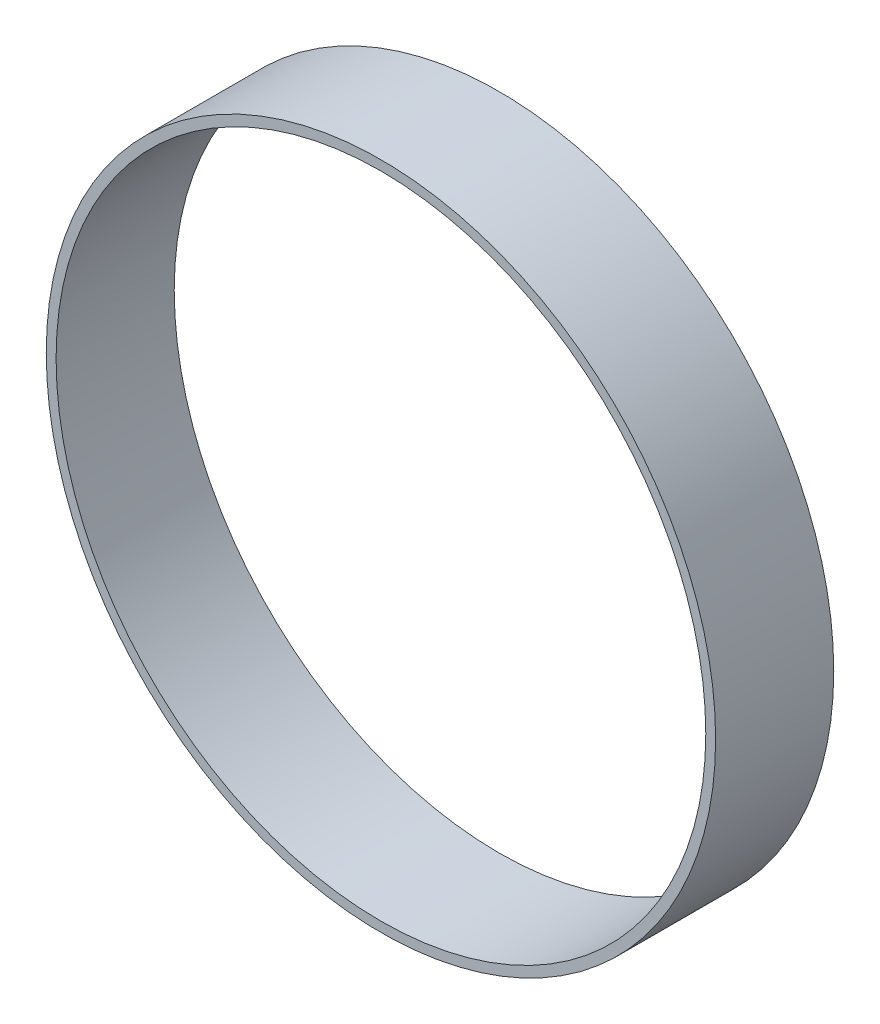
ISO-10303-21;
HEADER;
FILE_DESCRIPTION(('STEP AP214'),'2;1');
FILE_NAME('part.step','',(''),(''),'','','');
FILE_SCHEMA(('AUTOMOTIVE_DESIGN { 1 0 10303 214 1 1 1 1 }'));
ENDSEC;
DATA;
#1=APPLICATION_CONTEXT('core data for automotive mechanical design processes');
#2=APPLICATION_PROTOCOL_DEFINITION('international standard','automotive_design',2000,#1);
#3=PRODUCT_CONTEXT('',#1,'mechanical');
#4=PRODUCT('Part','Part','',(#3));
#5=PRODUCT_RELATED_PRODUCT_CATEGORY('part','',(#4));
#6=PRODUCT_DEFINITION_FORMATION('','',#4);
#7=PRODUCT_DEFINITION_CONTEXT('part definition',#1,'design');
#8=PRODUCT_DEFINITION('design','',#6,#7);
#9=PRODUCT_DEFINITION_SHAPE('','',#8);
#10=(LENGTH_UNIT() NAMED_UNIT(*) SI_UNIT(.MILLI.,.METRE.));
#11=(NAMED_UNIT(*) PLANE_ANGLE_UNIT() SI_UNIT($,.RADIAN.));
#12=(NAMED_UNIT(*) SI_UNIT($,.STERADIAN.) SOLID_ANGLE_UNIT());
#13=UNCERTAINTY_MEASURE_WITH_UNIT(LENGTH_MEASURE(1.E-05),#10,'distance_accuracy_value','');
#14=(GEOMETRIC_REPRESENTATION_CONTEXT(3) GLOBAL_UNCERTAINTY_ASSIGNED_CONTEXT((#13)) GLOBAL_UNIT_ASSIGNED_CONTEXT((#10,
#11,#12)) REPRESENTATION_CONTEXT('',''));
#15=CARTESIAN_POINT('',(0.,0.,0.));
#16=DIRECTION('',(0.,0.,1.));
#17=DIRECTION('',(1.,0.,0.));
#18=AXIS2_PLACEMENT_3D('',#15,#16,#17);
#19=CARTESIAN_POINT('',(0.,0.,38.1));
#20=DIRECTION('',(0.,0.,1.));
#21=DIRECTION('',(1.,0.,0.));
#22=AXIS2_PLACEMENT_3D('',#19,#20,#21);
#23=PLANE('',#22);
#24=CARTESIAN_POINT('',(0.,0.,38.1));
#25=DIRECTION('',(0.,0.,1.));
#26=DIRECTION('',(1.,0.,0.));
#27=AXIS2_PLACEMENT_3D('',#24,#25,#26);
#28=CIRCLE('',#27,107.95);
#29=CARTESIAN_POINT('',(-107.95,0.,38.1));
#30=VERTEX_POINT('',#29);
#31=EDGE_CURVE('E10',#30,#30,#28,.T.);
#32=ORIENTED_EDGE('',*,*,#31,.T.);
#33=EDGE_LOOP('',(#32));
#34=FACE_BOUND('',#33,.T.);
#35=CARTESIAN_POINT('',(0.,0.,38.1));
#36=DIRECTION('',(0.,0.,1.));
#37=DIRECTION('',(1.,0.,0.));
#38=AXIS2_PLACEMENT_3D('',#35,#36,#37);
#39=CIRCLE('',#38,104.775);
#40=CARTESIAN_POINT('',(-104.775,0.,38.1));
#41=VERTEX_POINT('',#40);
#42=EDGE_CURVE('E56',#41,#41,#39,.T.);
#43=ORIENTED_EDGE('',*,*,#42,.F.);
#44=EDGE_LOOP('',(#43));
#45=FACE_BOUND('',#44,.T.);
#46=ADVANCED_FACE('F43',(#34,#45),#23,.T.);
#47=CARTESIAN_POINT('',(0.,0.,0.));
#48=DIRECTION('',(0.,0.,1.));
#49=DIRECTION('',(1.,0.,0.));
#50=AXIS2_PLACEMENT_3D('',#47,#48,#49);
#51=PLANE('',#50);
#52=CARTESIAN_POINT('',(0.,0.,0.));
#53=DIRECTION('',(0.,0.,1.));
#54=DIRECTION('',(1.,0.,0.));
#55=AXIS2_PLACEMENT_3D('',#52,#53,#54);
#56=CIRCLE('',#55,107.95);
#57=CARTESIAN_POINT('',(-107.95,0.,0.));
#58=VERTEX_POINT('',#57);
#59=EDGE_CURVE('E47',#58,#58,#56,.T.);
#60=ORIENTED_EDGE('',*,*,#59,.F.);
#61=EDGE_LOOP('',(#60));
#62=FACE_BOUND('',#61,.T.);
#63=CARTESIAN_POINT('',(0.,0.,0.));
#64=DIRECTION('',(0.,0.,1.));
#65=DIRECTION('',(1.,0.,0.));
#66=AXIS2_PLACEMENT_3D('',#63,#64,#65);
#67=CIRCLE('',#66,104.775);
#68=CARTESIAN_POINT('',(-104.775,0.,0.));
#69=VERTEX_POINT('',#68);
#70=EDGE_CURVE('E58',#69,#69,#67,.T.);
#71=ORIENTED_EDGE('',*,*,#70,.T.);
#72=EDGE_LOOP('',(#71));
#73=FACE_BOUND('',#72,.T.);
#74=ADVANCED_FACE('F70',(#62,#73),#51,.F.);
#75=CARTESIAN_POINT('',(0.,0.,38.1));
#76=DIRECTION('',(0.,0.,-1.));
#77=DIRECTION('',(-1.,0.,0.));
#78=AXIS2_PLACEMENT_3D('',#75,#76,#77);
#79=CYLINDRICAL_SURFACE('',#78,107.95);
#80=CARTESIAN_POINT('',(-107.95,0.,38.1));
#81=CARTESIAN_POINT('',(-107.95,0.,37.703125));
#82=CARTESIAN_POINT('',(-107.95,0.,37.30625));
#83=CARTESIAN_POINT('',(-107.95,0.,36.5125));
#84=CARTESIAN_POINT('',(-107.95,0.,36.115625));
#85=CARTESIAN_POINT('',(-107.95,0.,35.321875));
#86=CARTESIAN_POINT('',(-107.95,0.,34.925));
#87=CARTESIAN_POINT('',(-107.95,0.,34.13125));
#88=CARTESIAN_POINT('',(-107.95,0.,33.734375));
#89=CARTESIAN_POINT('',(-107.95,0.,32.940625));
#90=CARTESIAN_POINT('',(-107.95,0.,32.54375));
#91=CARTESIAN_POINT('',(-107.95,0.,31.75));
#92=CARTESIAN_POINT('',(-107.95,0.,31.353125));
#93=CARTESIAN_POINT('',(-107.95,0.,30.559375));
#94=CARTESIAN_POINT('',(-107.95,0.,30.1625));
#95=CARTESIAN_POINT('',(-107.95,0.,29.36875));
#96=CARTESIAN_POINT('',(-107.95,0.,28.971875));
#97=CARTESIAN_POINT('',(-107.95,0.,28.178125));
#98=CARTESIAN_POINT('',(-107.95,0.,27.78125));
#99=CARTESIAN_POINT('',(-107.95,0.,26.9875));
#100=CARTESIAN_POINT('',(-107.95,0.,26.590625));
#101=CARTESIAN_POINT('',(-107.95,0.,25.796875));
#102=CARTESIAN_POINT('',(-107.95,0.,25.4));
#103=CARTESIAN_POINT('',(-107.95,0.,24.60625));
#104=CARTESIAN_POINT('',(-107.95,0.,24.209375));
#105=CARTESIAN_POINT('',(-107.95,0.,23.415625));
#106=CARTESIAN_POINT('',(-107.95,0.,23.01875));
#107=CARTESIAN_POINT('',(-107.95,0.,22.225));
#108=CARTESIAN_POINT('',(-107.95,0.,21.828125));
#109=CARTESIAN_POINT('',(-107.95,0.,21.034375));
#110=CARTESIAN_POINT('',(-107.95,0.,20.6375));
#111=CARTESIAN_POINT('',(-107.95,0.,19.84375));
#112=CARTESIAN_POINT('',(-107.95,0.,19.446875));
#113=CARTESIAN_POINT('',(-107.95,0.,18.653125));
#114=CARTESIAN_POINT('',(-107.95,0.,18.25625));
#115=CARTESIAN_POINT('',(-107.95,0.,17.4625));
#116=CARTESIAN_POINT('',(-107.95,0.,17.065625));
#117=CARTESIAN_POINT('',(-107.95,0.,16.271875));
#118=CARTESIAN_POINT('',(-107.95,0.,15.875));
#119=CARTESIAN_POINT('',(-107.95,0.,15.08125));
#120=CARTESIAN_POINT('',(-107.95,0.,14.684375));
#121=CARTESIAN_POINT('',(-107.95,0.,13.890625));
#122=CARTESIAN_POINT('',(-107.95,0.,13.49375));
#123=CARTESIAN_POINT('',(-107.95,0.,12.7));
#124=CARTESIAN_POINT('',(-107.95,0.,12.303125));
#125=CARTESIAN_POINT('',(-107.95,0.,11.509375));
#126=CARTESIAN_POINT('',(-107.95,0.,11.1125));
#127=CARTESIAN_POINT('',(-107.95,0.,10.31875));
#128=CARTESIAN_POINT('',(-107.95,0.,9.921875));
#129=CARTESIAN_POINT('',(-107.95,0.,9.128125));
#130=CARTESIAN_POINT('',(-107.95,0.,8.73125));
#131=CARTESIAN_POINT('',(-107.95,0.,7.9375));
#132=CARTESIAN_POINT('',(-107.95,0.,7.540625));
#133=CARTESIAN_POINT('',(-107.95,0.,6.746875));
#134=CARTESIAN_POINT('',(-107.95,0.,6.35));
#135=CARTESIAN_POINT('',(-107.95,0.,5.55625));
#136=CARTESIAN_POINT('',(-107.95,0.,5.159375));
#137=CARTESIAN_POINT('',(-107.95,0.,4.365625));
#138=CARTESIAN_POINT('',(-107.95,0.,3.96875));
#139=CARTESIAN_POINT('',(-107.95,0.,3.175));
#140=CARTESIAN_POINT('',(-107.95,0.,2.778125));
#141=CARTESIAN_POINT('',(-107.95,0.,1.984375));
#142=CARTESIAN_POINT('',(-107.95,0.,1.5875));
#143=CARTESIAN_POINT('',(-107.95,0.,0.79375));
#144=CARTESIAN_POINT('',(-107.95,0.,0.396875));
#145=CARTESIAN_POINT('',(-107.95,0.,0.));
#146=B_SPLINE_CURVE_WITH_KNOTS('',3,(#80,#81,#82,#83,#84,#85,#86,#87,#88,#89,#90,#91,#92,#93,
#94,#95,#96,#97,#98,#99,#100,#101,#102,#103,#104,#105,#106,#107,#108,#109,#110,#111,#112,#113,
#114,#115,#116,#117,#118,#119,#120,#121,#122,#123,#124,#125,#126,#127,#128,#129,#130,#131,#132,
#133,#134,#135,#136,#137,#138,#139,#140,#141,#142,#143,#144,#145),.UNSPECIFIED.,.F.,.F.,(4,2,2,
2,2,2,2,2,2,2,2,2,2,2,2,2,2,2,2,2,2,2,2,2,2,2,2,2,2,2,2,2,4),(0.,1.19062499999999,
2.38124999999999,3.571875,4.7625,5.953125,7.14375,8.33437499999999,9.525,10.715625,11.90625,
13.096875,14.2875,15.478125,16.66875,17.859375,19.05,20.240625,21.43125,22.621875,23.8125,
25.003125,26.19375,27.384375,28.575,29.765625,30.95625,32.146875,33.3375,34.528125,35.71875,
36.909375,38.1),.UNSPECIFIED.);
#147=EDGE_CURVE('BSEAM45',#30,#58,#146,.T.);
#148=ORIENTED_EDGE('',*,*,#31,.F.);
#149=ORIENTED_EDGE('',*,*,#59,.T.);
#150=ORIENTED_EDGE('',*,*,#147,.T.);
#151=ORIENTED_EDGE('',*,*,#147,.F.);
#152=EDGE_LOOP('',(#148,#150,#149,#151));
#153=FACE_BOUND('',#152,.T.);
#154=ADVANCED_FACE('F45',(#153),#79,.T.);
#155=CARTESIAN_POINT('',(0.,0.,38.1));
#156=DIRECTION('',(0.,0.,-1.));
#157=DIRECTION('',(-1.,0.,0.));
#158=AXIS2_PLACEMENT_3D('',#155,#156,#157);
#159=CYLINDRICAL_SURFACE('',#158,104.775);
#160=CARTESIAN_POINT('',(-104.775,0.,38.1));
#161=CARTESIAN_POINT('',(-104.775,0.,37.703125));
#162=CARTESIAN_POINT('',(-104.775,0.,37.30625));
#163=CARTESIAN_POINT('',(-104.775,0.,36.5125));
#164=CARTESIAN_POINT('',(-104.775,0.,36.115625));
#165=CARTESIAN_POINT('',(-104.775,0.,35.321875));
#166=CARTESIAN_POINT('',(-104.775,0.,34.925));
#167=CARTESIAN_POINT('',(-104.775,0.,34.13125));
#168=CARTESIAN_POINT('',(-104.775,0.,33.734375));
#169=CARTESIAN_POINT('',(-104.775,0.,32.940625));
#170=CARTESIAN_POINT('',(-104.775,0.,32.54375));
#171=CARTESIAN_POINT('',(-104.775,0.,31.75));
#172=CARTESIAN_POINT('',(-104.775,0.,31.353125));
#173=CARTESIAN_POINT('',(-104.775,0.,30.559375));
#174=CARTESIAN_POINT('',(-104.775,0.,30.1625));
#175=CARTESIAN_POINT('',(-104.775,0.,29.36875));
#176=CARTESIAN_POINT('',(-104.775,0.,28.971875));
#177=CARTESIAN_POINT('',(-104.775,0.,28.178125));
#178=CARTESIAN_POINT('',(-104.775,0.,27.78125));
#179=CARTESIAN_POINT('',(-104.775,0.,26.9875));
#180=CARTESIAN_POINT('',(-104.775,0.,26.590625));
#181=CARTESIAN_POINT('',(-104.775,0.,25.796875));
#182=CARTESIAN_POINT('',(-104.775,0.,25.4));
#183=CARTESIAN_POINT('',(-104.775,0.,24.60625));
#184=CARTESIAN_POINT('',(-104.775,0.,24.209375));
#185=CARTESIAN_POINT('',(-104.775,0.,23.415625));
#186=CARTESIAN_POINT('',(-104.775,0.,23.01875));
#187=CARTESIAN_POINT('',(-104.775,0.,22.225));
#188=CARTESIAN_POINT('',(-104.775,0.,21.828125));
#189=CARTESIAN_POINT('',(-104.775,0.,21.034375));
#190=CARTESIAN_POINT('',(-104.775,0.,20.6375));
#191=CARTESIAN_POINT('',(-104.775,0.,19.84375));
#192=CARTESIAN_POINT('',(-104.775,0.,19.446875));
#193=CARTESIAN_POINT('',(-104.775,0.,18.653125));
#194=CARTESIAN_POINT('',(-104.775,0.,18.25625));
#195=CARTESIAN_POINT('',(-104.775,0.,17.4625));
#196=CARTESIAN_POINT('',(-104.775,0.,17.065625));
#197=CARTESIAN_POINT('',(-104.775,0.,16.271875));
#198=CARTESIAN_POINT('',(-104.775,0.,15.875));
#199=CARTESIAN_POINT('',(-104.775,0.,15.08125));
#200=CARTESIAN_POINT('',(-104.775,0.,14.684375));
#201=CARTESIAN_POINT('',(-104.775,0.,13.890625));
#202=CARTESIAN_POINT('',(-104.775,0.,13.49375));
#203=CARTESIAN_POINT('',(-104.775,0.,12.7));
#204=CARTESIAN_POINT('',(-104.775,0.,12.303125));
#205=CARTESIAN_POINT('',(-104.775,0.,11.509375));
#206=CARTESIAN_POINT('',(-104.775,0.,11.1125));
#207=CARTESIAN_POINT('',(-104.775,0.,10.31875));
#208=CARTESIAN_POINT('',(-104.775,0.,9.921875));
#209=CARTESIAN_POINT('',(-104.775,0.,9.128125));
#210=CARTESIAN_POINT('',(-104.775,0.,8.73125));
#211=CARTESIAN_POINT('',(-104.775,0.,7.9375));
#212=CARTESIAN_POINT('',(-104.775,0.,7.540625));
#213=CARTESIAN_POINT('',(-104.775,0.,6.746875));
#214=CARTESIAN_POINT('',(-104.775,0.,6.35));
#215=CARTESIAN_POINT('',(-104.775,0.,5.55625));
#216=CARTESIAN_POINT('',(-104.775,0.,5.159375));
#217=CARTESIAN_POINT('',(-104.775,0.,4.365625));
#218=CARTESIAN_POINT('',(-104.775,0.,3.96875));
#219=CARTESIAN_POINT('',(-104.775,0.,3.175));
#220=CARTESIAN_POINT('',(-104.775,0.,2.778125));
#221=CARTESIAN_POINT('',(-104.775,0.,1.984375));
#222=CARTESIAN_POINT('',(-104.775,0.,1.5875));
#223=CARTESIAN_POINT('',(-104.775,0.,0.79375));
#224=CARTESIAN_POINT('',(-104.775,0.,0.396875));
#225=CARTESIAN_POINT('',(-104.775,0.,0.));
#226=B_SPLINE_CURVE_WITH_KNOTS('',3,(#160,#161,#162,#163,#164,#165,#166,#167,#168,#169,#170,
#171,#172,#173,#174,#175,#176,#177,#178,#179,#180,#181,#182,#183,#184,#185,#186,#187,#188,#189,
#190,#191,#192,#193,#194,#195,#196,#197,#198,#199,#200,#201,#202,#203,#204,#205,#206,#207,#208,
#209,#210,#211,#212,#213,#214,#215,#216,#217,#218,#219,#220,#221,#222,#223,#224,#225),
.UNSPECIFIED.,.F.,.F.,(4,2,2,2,2,2,2,2,2,2,2,2,2,2,2,2,2,2,2,2,2,2,2,2,2,2,2,2,2,2,2,2,4),(0.,
1.19062499999999,2.38124999999999,3.571875,4.7625,5.953125,7.14375,8.33437499999999,9.525,
10.715625,11.90625,13.096875,14.2875,15.478125,16.66875,17.859375,19.05,20.240625,21.43125,
22.621875,23.8125,25.003125,26.19375,27.384375,28.575,29.765625,30.95625,32.146875,33.3375,
34.528125,35.71875,36.909375,38.1),.UNSPECIFIED.);
#227=EDGE_CURVE('BSEAM66',#41,#69,#226,.T.);
#228=ORIENTED_EDGE('',*,*,#42,.T.);
#229=ORIENTED_EDGE('',*,*,#70,.F.);
#230=ORIENTED_EDGE('',*,*,#227,.T.);
#231=ORIENTED_EDGE('',*,*,#227,.F.);
#232=EDGE_LOOP('',(#228,#230,#229,#231));
#233=FACE_BOUND('',#232,.T.);
#234=ADVANCED_FACE('F66',(#233),#159,.F.);
#235=CLOSED_SHELL('',(#46,#74,#154,#234));
#236=MANIFOLD_SOLID_BREP('B2',#235);
#237=ADVANCED_BREP_SHAPE_REPRESENTATION('',(#18,#236),#14);
#238=SHAPE_DEFINITION_REPRESENTATION(#9,#237);
ENDSEC;
END-ISO-10303-21;
